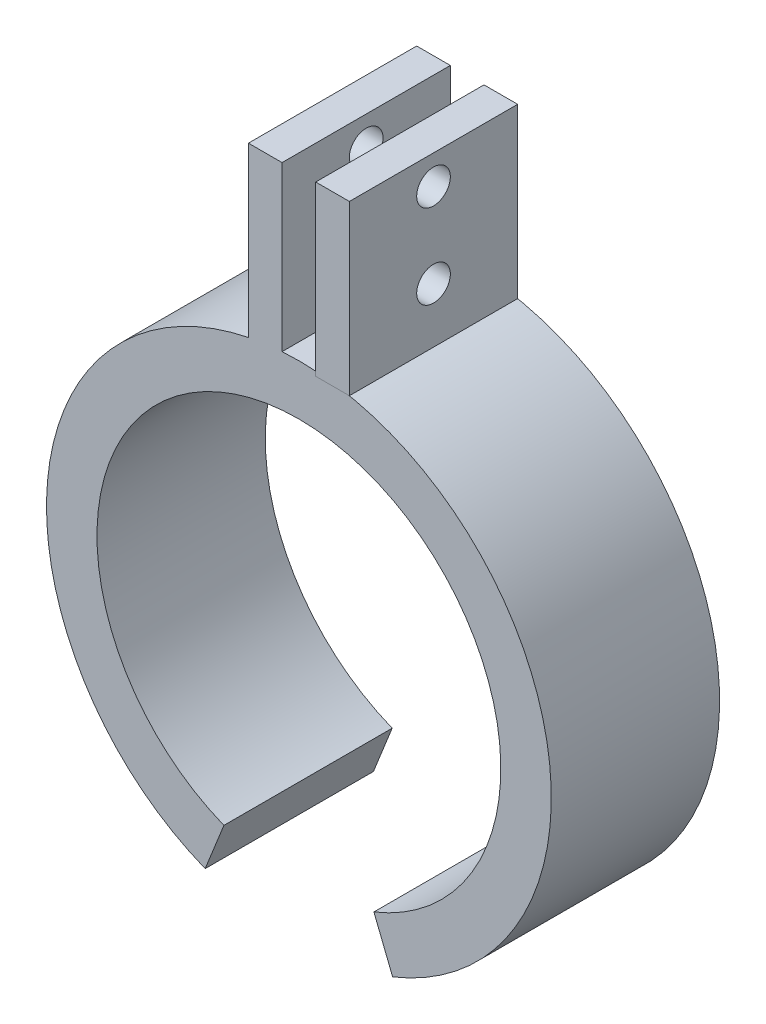
ISO-10303-21;
HEADER;
FILE_DESCRIPTION(('STEP AP214'),'2;1');
FILE_NAME('part.step','',(''),(''),'','','');
FILE_SCHEMA(('AUTOMOTIVE_DESIGN { 1 0 10303 214 1 1 1 1 }'));
ENDSEC;
DATA;
#1=APPLICATION_CONTEXT('core data for automotive mechanical design processes');
#2=APPLICATION_PROTOCOL_DEFINITION('international standard','automotive_design',2000,#1);
#3=PRODUCT_CONTEXT('',#1,'mechanical');
#4=PRODUCT('Part','Part','',(#3));
#5=PRODUCT_RELATED_PRODUCT_CATEGORY('part','',(#4));
#6=PRODUCT_DEFINITION_FORMATION('','',#4);
#7=PRODUCT_DEFINITION_CONTEXT('part definition',#1,'design');
#8=PRODUCT_DEFINITION('design','',#6,#7);
#9=PRODUCT_DEFINITION_SHAPE('','',#8);
#10=(LENGTH_UNIT() NAMED_UNIT(*) SI_UNIT(.MILLI.,.METRE.));
#11=(NAMED_UNIT(*) PLANE_ANGLE_UNIT() SI_UNIT($,.RADIAN.));
#12=(NAMED_UNIT(*) SI_UNIT($,.STERADIAN.) SOLID_ANGLE_UNIT());
#13=UNCERTAINTY_MEASURE_WITH_UNIT(LENGTH_MEASURE(1.E-05),#10,'distance_accuracy_value','');
#14=(GEOMETRIC_REPRESENTATION_CONTEXT(3) GLOBAL_UNCERTAINTY_ASSIGNED_CONTEXT((#13)) GLOBAL_UNIT_ASSIGNED_CONTEXT((#10,
#11,#12)) REPRESENTATION_CONTEXT('',''));
#15=CARTESIAN_POINT('',(0.,0.,0.));
#16=DIRECTION('',(0.,0.,1.));
#17=DIRECTION('',(1.,0.,0.));
#18=AXIS2_PLACEMENT_3D('',#15,#16,#17);
#19=CARTESIAN_POINT('',(3.,14.6969384566991,10.));
#20=DIRECTION('',(-1.,0.,0.));
#21=DIRECTION('',(0.,0.,1.));
#22=AXIS2_PLACEMENT_3D('',#19,#20,#21);
#23=PLANE('',#22);
#24=CARTESIAN_POINT('',(3.,22.9666295470958,5.));
#25=DIRECTION('',(-1.,0.,0.));
#26=DIRECTION('',(0.,0.,1.));
#27=AXIS2_PLACEMENT_3D('',#24,#25,#26);
#28=CIRCLE('',#27,1.);
#29=CARTESIAN_POINT('',(3.,22.9666295470958,6.));
#30=VERTEX_POINT('',#29);
#31=EDGE_CURVE('E117',#30,#30,#28,.T.);
#32=ORIENTED_EDGE('',*,*,#31,.T.);
#33=EDGE_LOOP('',(#32));
#34=FACE_BOUND('',#33,.T.);
#35=CARTESIAN_POINT('',(3.,17.9666295470958,5.));
#36=DIRECTION('',(-1.,0.,0.));
#37=DIRECTION('',(0.,0.,1.));
#38=AXIS2_PLACEMENT_3D('',#35,#36,#37);
#39=CIRCLE('',#38,1.);
#40=CARTESIAN_POINT('',(3.,17.9666295470958,6.));
#41=VERTEX_POINT('',#40);
#42=EDGE_CURVE('E127',#41,#41,#39,.T.);
#43=ORIENTED_EDGE('',*,*,#42,.T.);
#44=EDGE_LOOP('',(#43));
#45=FACE_BOUND('',#44,.T.);
#46=DIRECTION('',(0.,1.,0.));
#47=VECTOR('',#46,1.);
#48=CARTESIAN_POINT('',(3.,14.6969384566991,0.));
#49=LINE('',#48,#47);
#50=CARTESIAN_POINT('',(3.,14.6969384566991,0.));
#51=VERTEX_POINT('',#50);
#52=CARTESIAN_POINT('',(3.,24.6969384566991,0.));
#53=VERTEX_POINT('',#52);
#54=EDGE_CURVE('E115',#51,#53,#49,.T.);
#55=ORIENTED_EDGE('',*,*,#54,.T.);
#56=DIRECTION('',(0.,0.,-1.));
#57=VECTOR('',#56,1.);
#58=CARTESIAN_POINT('',(3.,24.6969384566991,10.));
#59=LINE('',#58,#57);
#60=CARTESIAN_POINT('',(3.,24.6969384566991,10.));
#61=VERTEX_POINT('',#60);
#62=EDGE_CURVE('E12',#61,#53,#59,.T.);
#63=ORIENTED_EDGE('',*,*,#62,.F.);
#64=DIRECTION('',(0.,1.,0.));
#65=VECTOR('',#64,1.);
#66=CARTESIAN_POINT('',(3.,14.6969384566991,10.));
#67=LINE('',#66,#65);
#68=CARTESIAN_POINT('',(3.,14.6969384566991,10.));
#69=VERTEX_POINT('',#68);
#70=EDGE_CURVE('E91',#69,#61,#67,.T.);
#71=ORIENTED_EDGE('',*,*,#70,.F.);
#72=DIRECTION('',(0.,0.,-1.));
#73=VECTOR('',#72,1.);
#74=CARTESIAN_POINT('',(3.,14.6969384566991,10.));
#75=LINE('',#74,#73);
#76=EDGE_CURVE('E67',#69,#51,#75,.T.);
#77=ORIENTED_EDGE('',*,*,#76,.T.);
#78=EDGE_LOOP('',(#55,#63,#71,#77));
#79=FACE_BOUND('',#78,.T.);
#80=ADVANCED_FACE('F49',(#34,#45,#79),#23,.F.);
#81=CARTESIAN_POINT('',(1.,24.6969384566991,10.));
#82=DIRECTION('',(0.,1.,0.));
#83=DIRECTION('',(0.,0.,1.));
#84=AXIS2_PLACEMENT_3D('',#81,#82,#83);
#85=PLANE('',#84);
#86=DIRECTION('',(1.,0.,0.));
#87=VECTOR('',#86,1.);
#88=CARTESIAN_POINT('',(1.,24.6969384566991,0.));
#89=LINE('',#88,#87);
#90=CARTESIAN_POINT('',(1.,24.6969384566991,0.));
#91=VERTEX_POINT('',#90);
#92=EDGE_CURVE('E100',#91,#53,#89,.T.);
#93=ORIENTED_EDGE('',*,*,#92,.F.);
#94=DIRECTION('',(0.,0.,-1.));
#95=VECTOR('',#94,1.);
#96=CARTESIAN_POINT('',(1.,24.6969384566991,10.));
#97=LINE('',#96,#95);
#98=CARTESIAN_POINT('',(1.,24.6969384566991,10.));
#99=VERTEX_POINT('',#98);
#100=EDGE_CURVE('E58',#99,#91,#97,.T.);
#101=ORIENTED_EDGE('',*,*,#100,.F.);
#102=DIRECTION('',(1.,0.,0.));
#103=VECTOR('',#102,1.);
#104=CARTESIAN_POINT('',(1.,24.6969384566991,10.));
#105=LINE('',#104,#103);
#106=EDGE_CURVE('E98',#99,#61,#105,.T.);
#107=ORIENTED_EDGE('',*,*,#106,.T.);
#108=ORIENTED_EDGE('',*,*,#62,.T.);
#109=EDGE_LOOP('',(#93,#101,#107,#108));
#110=FACE_BOUND('',#109,.T.);
#111=ADVANCED_FACE('F97',(#110),#85,.T.);
#112=CARTESIAN_POINT('',(1.,14.6969384566991,10.));
#113=DIRECTION('',(-1.,0.,0.));
#114=DIRECTION('',(0.,0.,1.));
#115=AXIS2_PLACEMENT_3D('',#112,#113,#114);
#116=PLANE('',#115);
#117=CARTESIAN_POINT('',(1.,22.9666295470958,5.));
#118=DIRECTION('',(-1.,0.,0.));
#119=DIRECTION('',(0.,0.,1.));
#120=AXIS2_PLACEMENT_3D('',#117,#118,#119);
#121=CIRCLE('',#120,1.);
#122=CARTESIAN_POINT('',(1.,22.9666295470958,6.));
#123=VERTEX_POINT('',#122);
#124=EDGE_CURVE('E52',#123,#123,#121,.T.);
#125=ORIENTED_EDGE('',*,*,#124,.F.);
#126=EDGE_LOOP('',(#125));
#127=FACE_BOUND('',#126,.T.);
#128=CARTESIAN_POINT('',(1.,17.9666295470958,5.));
#129=DIRECTION('',(-1.,0.,0.));
#130=DIRECTION('',(0.,0.,1.));
#131=AXIS2_PLACEMENT_3D('',#128,#129,#130);
#132=CIRCLE('',#131,1.);
#133=CARTESIAN_POINT('',(1.,17.9666295470958,6.));
#134=VERTEX_POINT('',#133);
#135=EDGE_CURVE('E125',#134,#134,#132,.T.);
#136=ORIENTED_EDGE('',*,*,#135,.F.);
#137=EDGE_LOOP('',(#136));
#138=FACE_BOUND('',#137,.T.);
#139=DIRECTION('',(0.,1.,0.));
#140=VECTOR('',#139,1.);
#141=CARTESIAN_POINT('',(1.,14.6969384566991,0.));
#142=LINE('',#141,#140);
#143=CARTESIAN_POINT('',(1.,14.6969384566991,0.));
#144=VERTEX_POINT('',#143);
#145=EDGE_CURVE('E119',#144,#91,#142,.T.);
#146=ORIENTED_EDGE('',*,*,#145,.F.);
#147=DIRECTION('',(0.,0.,-1.));
#148=VECTOR('',#147,1.);
#149=CARTESIAN_POINT('',(1.,14.6969384566991,10.));
#150=LINE('',#149,#148);
#151=CARTESIAN_POINT('',(1.,14.6969384566991,10.));
#152=VERTEX_POINT('',#151);
#153=EDGE_CURVE('E80',#152,#144,#150,.T.);
#154=ORIENTED_EDGE('',*,*,#153,.F.);
#155=DIRECTION('',(0.,1.,0.));
#156=VECTOR('',#155,1.);
#157=CARTESIAN_POINT('',(1.,14.6969384566991,10.));
#158=LINE('',#157,#156);
#159=EDGE_CURVE('E107',#152,#99,#158,.T.);
#160=ORIENTED_EDGE('',*,*,#159,.T.);
#161=ORIENTED_EDGE('',*,*,#100,.T.);
#162=EDGE_LOOP('',(#146,#154,#160,#161));
#163=FACE_BOUND('',#162,.T.);
#164=ADVANCED_FACE('F109',(#127,#138,#163),#116,.T.);
#165=CARTESIAN_POINT('',(3.,14.6969384566991,10.));
#166=DIRECTION('',(0.,-1.,0.));
#167=DIRECTION('',(0.,0.,-1.));
#168=AXIS2_PLACEMENT_3D('',#165,#166,#167);
#169=PLANE('',#168);
#170=DIRECTION('',(-1.,0.,0.));
#171=VECTOR('',#170,1.);
#172=CARTESIAN_POINT('',(3.,14.6969384566991,0.));
#173=LINE('',#172,#171);
#174=EDGE_CURVE('E121',#51,#144,#173,.T.);
#175=ORIENTED_EDGE('',*,*,#174,.F.);
#176=ORIENTED_EDGE('',*,*,#76,.F.);
#177=DIRECTION('',(-1.,0.,0.));
#178=VECTOR('',#177,1.);
#179=CARTESIAN_POINT('',(3.,14.6969384566991,10.));
#180=LINE('',#179,#178);
#181=EDGE_CURVE('E110',#69,#152,#180,.T.);
#182=ORIENTED_EDGE('',*,*,#181,.T.);
#183=ORIENTED_EDGE('',*,*,#153,.T.);
#184=EDGE_LOOP('',(#175,#176,#182,#183));
#185=FACE_BOUND('',#184,.T.);
#186=ADVANCED_FACE('F157',(#185),#169,.T.);
#187=CARTESIAN_POINT('',(0.,0.,10.));
#188=DIRECTION('',(0.,0.,-1.));
#189=DIRECTION('',(-1.,0.,0.));
#190=AXIS2_PLACEMENT_3D('',#187,#188,#189);
#191=PLANE('',#190);
#192=ORIENTED_EDGE('',*,*,#70,.T.);
#193=ORIENTED_EDGE('',*,*,#106,.F.);
#194=ORIENTED_EDGE('',*,*,#159,.F.);
#195=ORIENTED_EDGE('',*,*,#181,.F.);
#196=EDGE_LOOP('',(#192,#193,#194,#195));
#197=FACE_BOUND('',#196,.T.);
#198=ADVANCED_FACE('F106',(#197),#191,.F.);
#199=CARTESIAN_POINT('',(0.,0.,0.));
#200=DIRECTION('',(0.,0.,-1.));
#201=DIRECTION('',(-1.,0.,0.));
#202=AXIS2_PLACEMENT_3D('',#199,#200,#201);
#203=PLANE('',#202);
#204=ORIENTED_EDGE('',*,*,#54,.F.);
#205=ORIENTED_EDGE('',*,*,#174,.T.);
#206=ORIENTED_EDGE('',*,*,#145,.T.);
#207=ORIENTED_EDGE('',*,*,#92,.T.);
#208=EDGE_LOOP('',(#204,#205,#206,#207));
#209=FACE_BOUND('',#208,.T.);
#210=ADVANCED_FACE('F148',(#209),#203,.T.);
#211=CARTESIAN_POINT('',(15.,17.9666295470958,5.));
#212=DIRECTION('',(-1.,0.,0.));
#213=DIRECTION('',(0.,0.,1.));
#214=AXIS2_PLACEMENT_3D('',#211,#212,#213);
#215=CYLINDRICAL_SURFACE('',#214,1.);
#216=ORIENTED_EDGE('',*,*,#135,.T.);
#217=EDGE_LOOP('',(#216));
#218=FACE_BOUND('',#217,.T.);
#219=ORIENTED_EDGE('',*,*,#42,.F.);
#220=EDGE_LOOP('',(#219));
#221=FACE_BOUND('',#220,.T.);
#222=ADVANCED_FACE('F142',(#218,#221),#215,.F.);
#223=CARTESIAN_POINT('',(15.,22.9666295470958,5.));
#224=DIRECTION('',(-1.,0.,0.));
#225=DIRECTION('',(0.,0.,1.));
#226=AXIS2_PLACEMENT_3D('',#223,#224,#225);
#227=CYLINDRICAL_SURFACE('',#226,1.);
#228=ORIENTED_EDGE('',*,*,#124,.T.);
#229=EDGE_LOOP('',(#228));
#230=FACE_BOUND('',#229,.T.);
#231=ORIENTED_EDGE('',*,*,#31,.F.);
#232=EDGE_LOOP('',(#231));
#233=FACE_BOUND('',#232,.T.);
#234=ADVANCED_FACE('F140',(#230,#233),#227,.F.);
#235=CLOSED_SHELL('',(#80,#111,#164,#186,#198,#210,#222,#234));
#236=MANIFOLD_SOLID_BREP('B2',#235);
#237=CARTESIAN_POINT('',(0.,0.,10.));
#238=DIRECTION('',(0.,0.,-1.));
#239=DIRECTION('',(-1.,0.,0.));
#240=AXIS2_PLACEMENT_3D('',#237,#238,#239);
#241=CYLINDRICAL_SURFACE('',#240,15.);
#242=DIRECTION('',(0.,0.,1.));
#243=VECTOR('',#242,1.);
#244=CARTESIAN_POINT('',(-3.,14.6969384566991,0.));
#245=LINE('',#244,#243);
#246=CARTESIAN_POINT('',(-3.,14.6969384566991,0.));
#247=VERTEX_POINT('',#246);
#248=CARTESIAN_POINT('',(-3.,14.6969384566991,10.));
#249=VERTEX_POINT('',#248);
#250=EDGE_CURVE('E319',#247,#249,#245,.T.);
#251=ORIENTED_EDGE('',*,*,#250,.F.);
#252=CARTESIAN_POINT('',(0.,0.,0.));
#253=DIRECTION('',(0.,0.,1.));
#254=DIRECTION('',(1.,0.,0.));
#255=AXIS2_PLACEMENT_3D('',#252,#253,#254);
#256=CIRCLE('',#255,15.);
#257=CARTESIAN_POINT('',(-5.57086014531156,-13.9271503632789,0.));
#258=VERTEX_POINT('',#257);
#259=EDGE_CURVE('E326',#247,#258,#256,.T.);
#260=ORIENTED_EDGE('',*,*,#259,.T.);
#261=DIRECTION('',(0.,0.,-1.));
#262=VECTOR('',#261,1.);
#263=CARTESIAN_POINT('',(-5.57086014531156,-13.9271503632789,10.));
#264=LINE('',#263,#262);
#265=CARTESIAN_POINT('',(-5.57086014531156,-13.9271503632789,10.));
#266=VERTEX_POINT('',#265);
#267=EDGE_CURVE('E47',#266,#258,#264,.T.);
#268=ORIENTED_EDGE('',*,*,#267,.F.);
#269=CARTESIAN_POINT('',(0.,0.,10.));
#270=DIRECTION('',(0.,0.,1.));
#271=DIRECTION('',(1.,0.,0.));
#272=AXIS2_PLACEMENT_3D('',#269,#270,#271);
#273=CIRCLE('',#272,15.);
#274=EDGE_CURVE('E266',#249,#266,#273,.T.);
#275=ORIENTED_EDGE('',*,*,#274,.F.);
#276=EDGE_LOOP('',(#251,#260,#268,#275));
#277=FACE_BOUND('',#276,.T.);
#278=ADVANCED_FACE('F215',(#277),#241,.T.);
#279=CARTESIAN_POINT('',(5.57086014531155,-13.9271503632789,0.));
#280=VERTEX_POINT('',#279);
#281=CARTESIAN_POINT('',(-1.,14.9666295470958,0.));
#282=VERTEX_POINT('',#281);
#283=EDGE_CURVE('E342',#280,#282,#256,.T.);
#284=ORIENTED_EDGE('',*,*,#283,.T.);
#285=DIRECTION('',(0.,0.,-1.));
#286=VECTOR('',#285,1.);
#287=CARTESIAN_POINT('',(-1.,14.9666295470958,10.));
#288=LINE('',#287,#286);
#289=CARTESIAN_POINT('',(-1.,14.9666295470958,10.));
#290=VERTEX_POINT('',#289);
#291=EDGE_CURVE('E298',#282,#290,#288,.F.);
#292=ORIENTED_EDGE('',*,*,#291,.T.);
#293=CARTESIAN_POINT('',(5.57086014531155,-13.9271503632789,10.));
#294=VERTEX_POINT('',#293);
#295=EDGE_CURVE('E327',#294,#290,#273,.T.);
#296=ORIENTED_EDGE('',*,*,#295,.F.);
#297=DIRECTION('',(0.,0.,-1.));
#298=VECTOR('',#297,1.);
#299=CARTESIAN_POINT('',(5.57086014531155,-13.9271503632789,10.));
#300=LINE('',#299,#298);
#301=EDGE_CURVE('E242',#294,#280,#300,.T.);
#302=ORIENTED_EDGE('',*,*,#301,.T.);
#303=EDGE_LOOP('',(#284,#292,#296,#302));
#304=FACE_BOUND('',#303,.T.);
#305=ADVANCED_FACE('F217',(#304),#241,.T.);
#306=CARTESIAN_POINT('',(-4.45668811624925,-11.1417202906231,10.));
#307=DIRECTION('',(0.928476690885259,-0.371390676354104,0.));
#308=DIRECTION('',(0.371390676354104,0.928476690885259,0.));
#309=AXIS2_PLACEMENT_3D('',#306,#307,#308);
#310=PLANE('',#309);
#311=DIRECTION('',(-0.371390676354104,-0.928476690885259,0.));
#312=VECTOR('',#311,1.);
#313=CARTESIAN_POINT('',(-4.45668811624925,-11.1417202906231,0.));
#314=LINE('',#313,#312);
#315=CARTESIAN_POINT('',(-4.45668811624925,-11.1417202906231,0.));
#316=VERTEX_POINT('',#315);
#317=EDGE_CURVE('E345',#316,#258,#314,.T.);
#318=ORIENTED_EDGE('',*,*,#317,.F.);
#319=DIRECTION('',(0.,0.,-1.));
#320=VECTOR('',#319,1.);
#321=CARTESIAN_POINT('',(-4.45668811624925,-11.1417202906231,10.));
#322=LINE('',#321,#320);
#323=CARTESIAN_POINT('',(-4.45668811624925,-11.1417202906231,10.));
#324=VERTEX_POINT('',#323);
#325=EDGE_CURVE('E225',#324,#316,#322,.T.);
#326=ORIENTED_EDGE('',*,*,#325,.F.);
#327=DIRECTION('',(-0.371390676354104,-0.928476690885259,0.));
#328=VECTOR('',#327,1.);
#329=CARTESIAN_POINT('',(-4.45668811624925,-11.1417202906231,10.));
#330=LINE('',#329,#328);
#331=EDGE_CURVE('E331',#324,#266,#330,.T.);
#332=ORIENTED_EDGE('',*,*,#331,.T.);
#333=ORIENTED_EDGE('',*,*,#267,.T.);
#334=EDGE_LOOP('',(#318,#326,#332,#333));
#335=FACE_BOUND('',#334,.T.);
#336=ADVANCED_FACE('F396',(#335),#310,.T.);
#337=CARTESIAN_POINT('',(0.,0.,10.));
#338=DIRECTION('',(0.,0.,-1.));
#339=DIRECTION('',(-1.,0.,0.));
#340=AXIS2_PLACEMENT_3D('',#337,#338,#339);
#341=CYLINDRICAL_SURFACE('',#340,12.);
#342=CARTESIAN_POINT('',(0.,0.,0.));
#343=DIRECTION('',(0.,0.,1.));
#344=DIRECTION('',(1.,0.,0.));
#345=AXIS2_PLACEMENT_3D('',#342,#343,#344);
#346=CIRCLE('',#345,12.);
#347=CARTESIAN_POINT('',(4.45668811624924,-11.1417202906231,0.));
#348=VERTEX_POINT('',#347);
#349=EDGE_CURVE('E349',#348,#316,#346,.T.);
#350=ORIENTED_EDGE('',*,*,#349,.F.);
#351=DIRECTION('',(0.,0.,-1.));
#352=VECTOR('',#351,1.);
#353=CARTESIAN_POINT('',(4.45668811624924,-11.1417202906231,10.));
#354=LINE('',#353,#352);
#355=CARTESIAN_POINT('',(4.45668811624924,-11.1417202906231,10.));
#356=VERTEX_POINT('',#355);
#357=EDGE_CURVE('E359',#356,#348,#354,.T.);
#358=ORIENTED_EDGE('',*,*,#357,.F.);
#359=CARTESIAN_POINT('',(0.,0.,10.));
#360=DIRECTION('',(0.,0.,1.));
#361=DIRECTION('',(1.,0.,0.));
#362=AXIS2_PLACEMENT_3D('',#359,#360,#361);
#363=CIRCLE('',#362,12.);
#364=EDGE_CURVE('E335',#356,#324,#363,.T.);
#365=ORIENTED_EDGE('',*,*,#364,.T.);
#366=ORIENTED_EDGE('',*,*,#325,.T.);
#367=EDGE_LOOP('',(#350,#358,#365,#366));
#368=FACE_BOUND('',#367,.T.);
#369=ADVANCED_FACE('F399',(#368),#341,.F.);
#370=CARTESIAN_POINT('',(5.57086014531155,-13.9271503632789,10.));
#371=DIRECTION('',(-0.928476690885259,-0.371390676354103,0.));
#372=DIRECTION('',(0.371390676354103,-0.928476690885259,0.));
#373=AXIS2_PLACEMENT_3D('',#370,#371,#372);
#374=PLANE('',#373);
#375=DIRECTION('',(-0.371390676354103,0.928476690885259,0.));
#376=VECTOR('',#375,1.);
#377=CARTESIAN_POINT('',(5.57086014531155,-13.9271503632789,0.));
#378=LINE('',#377,#376);
#379=EDGE_CURVE('E353',#280,#348,#378,.T.);
#380=ORIENTED_EDGE('',*,*,#379,.F.);
#381=ORIENTED_EDGE('',*,*,#301,.F.);
#382=DIRECTION('',(-0.371390676354103,0.928476690885259,0.));
#383=VECTOR('',#382,1.);
#384=CARTESIAN_POINT('',(5.57086014531155,-13.9271503632789,10.));
#385=LINE('',#384,#383);
#386=EDGE_CURVE('E339',#294,#356,#385,.T.);
#387=ORIENTED_EDGE('',*,*,#386,.T.);
#388=ORIENTED_EDGE('',*,*,#357,.T.);
#389=EDGE_LOOP('',(#380,#381,#387,#388));
#390=FACE_BOUND('',#389,.T.);
#391=ADVANCED_FACE('F403',(#390),#374,.T.);
#392=CARTESIAN_POINT('',(0.,0.,10.));
#393=DIRECTION('',(0.,0.,1.));
#394=DIRECTION('',(1.,0.,0.));
#395=AXIS2_PLACEMENT_3D('',#392,#393,#394);
#396=PLANE('',#395);
#397=ORIENTED_EDGE('',*,*,#295,.T.);
#398=DIRECTION('',(0.,1.,0.));
#399=VECTOR('',#398,1.);
#400=CARTESIAN_POINT('',(-1.,14.6969384566991,10.));
#401=LINE('',#400,#399);
#402=CARTESIAN_POINT('',(-1.,24.6969384566991,10.));
#403=VERTEX_POINT('',#402);
#404=EDGE_CURVE('E380',#290,#403,#401,.T.);
#405=ORIENTED_EDGE('',*,*,#404,.T.);
#406=DIRECTION('',(1.,0.,0.));
#407=VECTOR('',#406,1.);
#408=CARTESIAN_POINT('',(-3.,24.6969384566991,10.));
#409=LINE('',#408,#407);
#410=CARTESIAN_POINT('',(-3.,24.6969384566991,10.));
#411=VERTEX_POINT('',#410);
#412=EDGE_CURVE('E313',#411,#403,#409,.T.);
#413=ORIENTED_EDGE('',*,*,#412,.F.);
#414=DIRECTION('',(0.,1.,0.));
#415=VECTOR('',#414,1.);
#416=CARTESIAN_POINT('',(-3.,14.6969384566991,10.));
#417=LINE('',#416,#415);
#418=EDGE_CURVE('E233',#249,#411,#417,.T.);
#419=ORIENTED_EDGE('',*,*,#418,.F.);
#420=ORIENTED_EDGE('',*,*,#274,.T.);
#421=ORIENTED_EDGE('',*,*,#331,.F.);
#422=ORIENTED_EDGE('',*,*,#364,.F.);
#423=ORIENTED_EDGE('',*,*,#386,.F.);
#424=EDGE_LOOP('',(#397,#405,#413,#419,#420,#421,#422,#423));
#425=FACE_BOUND('',#424,.T.);
#426=ADVANCED_FACE('F401',(#425),#396,.T.);
#427=CARTESIAN_POINT('',(0.,0.,0.));
#428=DIRECTION('',(0.,0.,1.));
#429=DIRECTION('',(1.,0.,0.));
#430=AXIS2_PLACEMENT_3D('',#427,#428,#429);
#431=PLANE('',#430);
#432=ORIENTED_EDGE('',*,*,#259,.F.);
#433=DIRECTION('',(0.,1.,0.));
#434=VECTOR('',#433,1.);
#435=CARTESIAN_POINT('',(-3.,14.6969384566991,0.));
#436=LINE('',#435,#434);
#437=CARTESIAN_POINT('',(-3.,24.6969384566991,0.));
#438=VERTEX_POINT('',#437);
#439=EDGE_CURVE('E306',#247,#438,#436,.T.);
#440=ORIENTED_EDGE('',*,*,#439,.T.);
#441=DIRECTION('',(1.,0.,0.));
#442=VECTOR('',#441,1.);
#443=CARTESIAN_POINT('',(-3.,24.6969384566991,0.));
#444=LINE('',#443,#442);
#445=CARTESIAN_POINT('',(-1.,24.6969384566991,0.));
#446=VERTEX_POINT('',#445);
#447=EDGE_CURVE('E301',#438,#446,#444,.T.);
#448=ORIENTED_EDGE('',*,*,#447,.T.);
#449=DIRECTION('',(0.,1.,0.));
#450=VECTOR('',#449,1.);
#451=CARTESIAN_POINT('',(-1.,14.6969384566991,0.));
#452=LINE('',#451,#450);
#453=EDGE_CURVE('E291',#282,#446,#452,.T.);
#454=ORIENTED_EDGE('',*,*,#453,.F.);
#455=ORIENTED_EDGE('',*,*,#283,.F.);
#456=ORIENTED_EDGE('',*,*,#379,.T.);
#457=ORIENTED_EDGE('',*,*,#349,.T.);
#458=ORIENTED_EDGE('',*,*,#317,.T.);
#459=EDGE_LOOP('',(#432,#440,#448,#454,#455,#456,#457,#458));
#460=FACE_BOUND('',#459,.T.);
#461=ADVANCED_FACE('F305',(#460),#431,.F.);
#462=CARTESIAN_POINT('',(-1.,14.6969384566991,0.));
#463=DIRECTION('',(1.,0.,0.));
#464=DIRECTION('',(0.,0.,-1.));
#465=AXIS2_PLACEMENT_3D('',#462,#463,#464);
#466=PLANE('',#465);
#467=CARTESIAN_POINT('',(-1.,22.9666295470958,5.));
#468=DIRECTION('',(1.,0.,0.));
#469=DIRECTION('',(0.,0.,-1.));
#470=AXIS2_PLACEMENT_3D('',#467,#468,#469);
#471=CIRCLE('',#470,1.);
#472=CARTESIAN_POINT('',(-1.,22.9666295470958,4.));
#473=VERTEX_POINT('',#472);
#474=EDGE_CURVE('E376',#473,#473,#471,.T.);
#475=ORIENTED_EDGE('',*,*,#474,.F.);
#476=EDGE_LOOP('',(#475));
#477=FACE_BOUND('',#476,.T.);
#478=CARTESIAN_POINT('',(-1.,17.9666295470958,5.));
#479=DIRECTION('',(1.,0.,0.));
#480=DIRECTION('',(0.,0.,-1.));
#481=AXIS2_PLACEMENT_3D('',#478,#479,#480);
#482=CIRCLE('',#481,1.);
#483=CARTESIAN_POINT('',(-1.,17.9666295470958,4.));
#484=VERTEX_POINT('',#483);
#485=EDGE_CURVE('E366',#484,#484,#482,.T.);
#486=ORIENTED_EDGE('',*,*,#485,.F.);
#487=EDGE_LOOP('',(#486));
#488=FACE_BOUND('',#487,.T.);
#489=ORIENTED_EDGE('',*,*,#291,.F.);
#490=ORIENTED_EDGE('',*,*,#453,.T.);
#491=DIRECTION('',(0.,0.,1.));
#492=VECTOR('',#491,1.);
#493=CARTESIAN_POINT('',(-1.,24.6969384566991,0.));
#494=LINE('',#493,#492);
#495=EDGE_CURVE('E295',#446,#403,#494,.T.);
#496=ORIENTED_EDGE('',*,*,#495,.T.);
#497=ORIENTED_EDGE('',*,*,#404,.F.);
#498=EDGE_LOOP('',(#489,#490,#496,#497));
#499=FACE_BOUND('',#498,.T.);
#500=ADVANCED_FACE('F293',(#477,#488,#499),#466,.T.);
#501=CARTESIAN_POINT('',(-3.,14.6969384566991,0.));
#502=DIRECTION('',(1.,0.,0.));
#503=DIRECTION('',(0.,0.,-1.));
#504=AXIS2_PLACEMENT_3D('',#501,#502,#503);
#505=PLANE('',#504);
#506=CARTESIAN_POINT('',(-3.,22.9666295470958,5.));
#507=DIRECTION('',(1.,0.,0.));
#508=DIRECTION('',(0.,0.,-1.));
#509=AXIS2_PLACEMENT_3D('',#506,#507,#508);
#510=CIRCLE('',#509,1.);
#511=CARTESIAN_POINT('',(-3.,22.9666295470958,4.));
#512=VERTEX_POINT('',#511);
#513=EDGE_CURVE('E219',#512,#512,#510,.T.);
#514=ORIENTED_EDGE('',*,*,#513,.T.);
#515=EDGE_LOOP('',(#514));
#516=FACE_BOUND('',#515,.T.);
#517=CARTESIAN_POINT('',(-3.,17.9666295470958,5.));
#518=DIRECTION('',(1.,0.,0.));
#519=DIRECTION('',(0.,0.,-1.));
#520=AXIS2_PLACEMENT_3D('',#517,#518,#519);
#521=CIRCLE('',#520,1.);
#522=CARTESIAN_POINT('',(-3.,17.9666295470958,4.));
#523=VERTEX_POINT('',#522);
#524=EDGE_CURVE('E363',#523,#523,#521,.T.);
#525=ORIENTED_EDGE('',*,*,#524,.T.);
#526=EDGE_LOOP('',(#525));
#527=FACE_BOUND('',#526,.T.);
#528=ORIENTED_EDGE('',*,*,#418,.T.);
#529=DIRECTION('',(0.,0.,1.));
#530=VECTOR('',#529,1.);
#531=CARTESIAN_POINT('',(-3.,24.6969384566991,0.));
#532=LINE('',#531,#530);
#533=EDGE_CURVE('E315',#438,#411,#532,.T.);
#534=ORIENTED_EDGE('',*,*,#533,.F.);
#535=ORIENTED_EDGE('',*,*,#439,.F.);
#536=ORIENTED_EDGE('',*,*,#250,.T.);
#537=EDGE_LOOP('',(#528,#534,#535,#536));
#538=FACE_BOUND('',#537,.T.);
#539=ADVANCED_FACE('F390',(#516,#527,#538),#505,.F.);
#540=CARTESIAN_POINT('',(-3.,24.6969384566991,0.));
#541=DIRECTION('',(0.,-1.,0.));
#542=DIRECTION('',(0.,0.,-1.));
#543=AXIS2_PLACEMENT_3D('',#540,#541,#542);
#544=PLANE('',#543);
#545=ORIENTED_EDGE('',*,*,#412,.T.);
#546=ORIENTED_EDGE('',*,*,#495,.F.);
#547=ORIENTED_EDGE('',*,*,#447,.F.);
#548=ORIENTED_EDGE('',*,*,#533,.T.);
#549=EDGE_LOOP('',(#545,#546,#547,#548));
#550=FACE_BOUND('',#549,.T.);
#551=ADVANCED_FACE('F312',(#550),#544,.F.);
#552=CARTESIAN_POINT('',(15.,17.9666295470958,5.));
#553=DIRECTION('',(-1.,0.,0.));
#554=DIRECTION('',(0.,0.,1.));
#555=AXIS2_PLACEMENT_3D('',#552,#553,#554);
#556=CYLINDRICAL_SURFACE('',#555,1.);
#557=ORIENTED_EDGE('',*,*,#485,.T.);
#558=EDGE_LOOP('',(#557));
#559=FACE_BOUND('',#558,.T.);
#560=ORIENTED_EDGE('',*,*,#524,.F.);
#561=EDGE_LOOP('',(#560));
#562=FACE_BOUND('',#561,.T.);
#563=ADVANCED_FACE('F464',(#559,#562),#556,.F.);
#564=CARTESIAN_POINT('',(15.,22.9666295470958,5.));
#565=DIRECTION('',(-1.,0.,0.));
#566=DIRECTION('',(0.,0.,1.));
#567=AXIS2_PLACEMENT_3D('',#564,#565,#566);
#568=CYLINDRICAL_SURFACE('',#567,1.);
#569=ORIENTED_EDGE('',*,*,#474,.T.);
#570=EDGE_LOOP('',(#569));
#571=FACE_BOUND('',#570,.T.);
#572=ORIENTED_EDGE('',*,*,#513,.F.);
#573=EDGE_LOOP('',(#572));
#574=FACE_BOUND('',#573,.T.);
#575=ADVANCED_FACE('F489',(#571,#574),#568,.F.);
#576=CLOSED_SHELL('',(#278,#305,#336,#369,#391,#426,#461,#500,#539,#551,#563,#575));
#577=MANIFOLD_SOLID_BREP('B6',#576);
#578=ADVANCED_BREP_SHAPE_REPRESENTATION('',(#18,#236,#577),#14);
#579=SHAPE_DEFINITION_REPRESENTATION(#9,#578);
ENDSEC;
END-ISO-10303-21;
